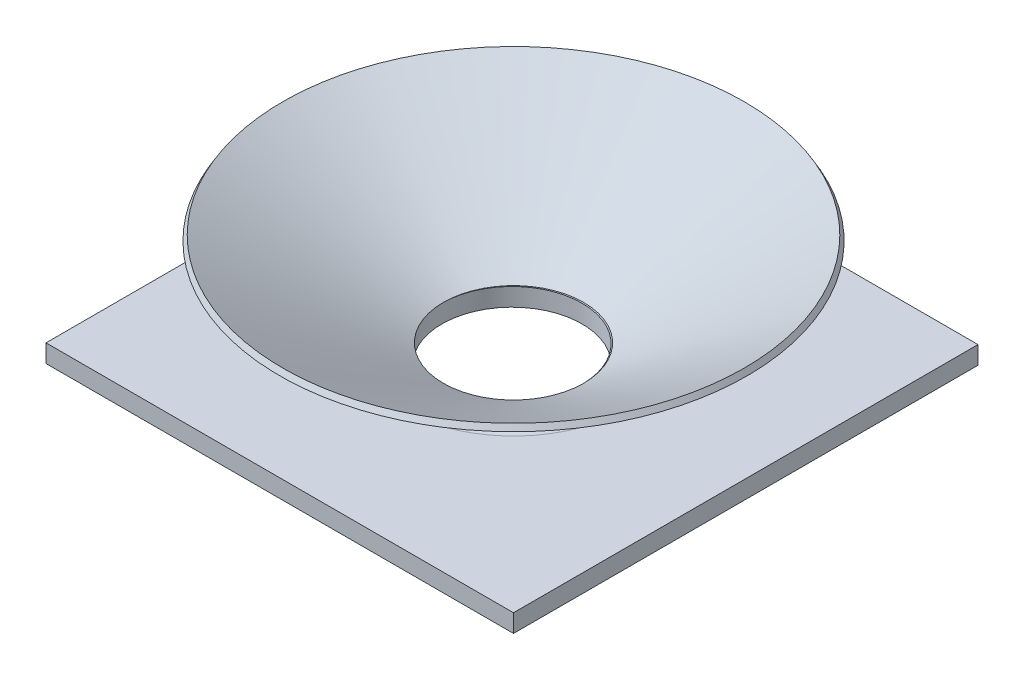
ISO-10303-21;
HEADER;
FILE_DESCRIPTION(('STEP AP214'),'2;1');
FILE_NAME('part.step','',(''),(''),'','','');
FILE_SCHEMA(('AUTOMOTIVE_DESIGN { 1 0 10303 214 1 1 1 1 }'));
ENDSEC;
DATA;
#1=APPLICATION_CONTEXT('core data for automotive mechanical design processes');
#2=APPLICATION_PROTOCOL_DEFINITION('international standard','automotive_design',2000,#1);
#3=PRODUCT_CONTEXT('',#1,'mechanical');
#4=PRODUCT('Part','Part','',(#3));
#5=PRODUCT_RELATED_PRODUCT_CATEGORY('part','',(#4));
#6=PRODUCT_DEFINITION_FORMATION('','',#4);
#7=PRODUCT_DEFINITION_CONTEXT('part definition',#1,'design');
#8=PRODUCT_DEFINITION('design','',#6,#7);
#9=PRODUCT_DEFINITION_SHAPE('','',#8);
#10=(LENGTH_UNIT() NAMED_UNIT(*) SI_UNIT(.MILLI.,.METRE.));
#11=(NAMED_UNIT(*) PLANE_ANGLE_UNIT() SI_UNIT($,.RADIAN.));
#12=(NAMED_UNIT(*) SI_UNIT($,.STERADIAN.) SOLID_ANGLE_UNIT());
#13=UNCERTAINTY_MEASURE_WITH_UNIT(LENGTH_MEASURE(1.E-05),#10,'distance_accuracy_value','');
#14=(GEOMETRIC_REPRESENTATION_CONTEXT(3) GLOBAL_UNCERTAINTY_ASSIGNED_CONTEXT((#13)) GLOBAL_UNIT_ASSIGNED_CONTEXT((#10,
#11,#12)) REPRESENTATION_CONTEXT('',''));
#15=CARTESIAN_POINT('',(0.,0.,0.));
#16=DIRECTION('',(0.,0.,1.));
#17=DIRECTION('',(1.,0.,0.));
#18=AXIS2_PLACEMENT_3D('',#15,#16,#17);
#19=CARTESIAN_POINT('',(-13.7068878020605,0.,0.));
#20=DIRECTION('',(0.,1.,0.));
#21=DIRECTION('',(0.,0.,1.));
#22=AXIS2_PLACEMENT_3D('',#19,#20,#21);
#23=PLANE('',#22);
#24=CARTESIAN_POINT('',(0.,0.,0.251460001656552));
#25=DIRECTION('',(0.,1.,0.));
#26=DIRECTION('',(0.,0.,1.));
#27=AXIS2_PLACEMENT_3D('',#24,#25,#26);
#28=CIRCLE('',#27,11.72);
#29=CARTESIAN_POINT('',(-11.7183670393751,0.,0.0558227595799678));
#30=VERTEX_POINT('',#29);
#31=CARTESIAN_POINT('',(11.7183670393751,0.,0.0558227595806369));
#32=VERTEX_POINT('',#31);
#33=EDGE_CURVE('E141',#30,#32,#28,.T.);
#34=ORIENTED_EDGE('',*,*,#33,.F.);
#35=CARTESIAN_POINT('',(0.,0.,0.));
#36=DIRECTION('',(0.,-1.,0.));
#37=DIRECTION('',(0.,0.,-1.));
#38=AXIS2_PLACEMENT_3D('',#35,#36,#37);
#39=CIRCLE('',#38,11.7185);
#40=EDGE_CURVE('E11',#32,#30,#39,.T.);
#41=ORIENTED_EDGE('',*,*,#40,.F.);
#42=EDGE_LOOP('',(#34,#41));
#43=FACE_BOUND('',#42,.T.);
#44=ADVANCED_FACE('F32',(#43),#23,.F.);
#45=CARTESIAN_POINT('',(0.,0.,0.));
#46=DIRECTION('',(0.,1.,0.));
#47=DIRECTION('',(0.,0.,1.));
#48=AXIS2_PLACEMENT_3D('',#45,#46,#47);
#49=CONICAL_SURFACE('',#48,11.7185,1.04382252715762);
#50=CARTESIAN_POINT('',(0.,15.625,0.));
#51=DIRECTION('',(0.,-1.,0.));
#52=DIRECTION('',(0.,0.,-1.));
#53=AXIS2_PLACEMENT_3D('',#50,#51,#52);
#54=CIRCLE('',#53,38.5720799966869);
#55=CARTESIAN_POINT('',(0.,15.625,-38.5720799966869));
#56=VERTEX_POINT('',#55);
#57=EDGE_CURVE('E39',#56,#56,#54,.T.);
#58=ORIENTED_EDGE('',*,*,#57,.F.);
#59=EDGE_LOOP('',(#58));
#60=FACE_BOUND('',#59,.T.);
#61=ORIENTED_EDGE('',*,*,#40,.T.);
#62=CARTESIAN_POINT('',(0.,0.,0.));
#63=DIRECTION('',(0.,-1.,0.));
#64=DIRECTION('',(0.,0.,-1.));
#65=AXIS2_PLACEMENT_3D('',#62,#63,#64);
#66=CIRCLE('',#65,11.7185);
#67=EDGE_CURVE('E49',#32,#30,#66,.F.);
#68=ORIENTED_EDGE('',*,*,#67,.F.);
#69=EDGE_LOOP('',(#61,#68));
#70=FACE_BOUND('',#69,.T.);
#71=ADVANCED_FACE('F135',(#60,#70),#49,.F.);
#72=CARTESIAN_POINT('',(0.,15.625,0.));
#73=DIRECTION('',(0.,-1.,0.));
#74=DIRECTION('',(0.,0.,-1.));
#75=AXIS2_PLACEMENT_3D('',#72,#73,#74);
#76=CONICAL_SURFACE('',#75,38.5720799966869,0.526973799637287);
#77=CARTESIAN_POINT('',(0.,14.7606670373823,0.));
#78=DIRECTION('',(0.,-1.,0.));
#79=DIRECTION('',(0.,0.,-1.));
#80=AXIS2_PLACEMENT_3D('',#77,#78,#79);
#81=CIRCLE('',#80,39.075);
#82=CARTESIAN_POINT('',(0.,14.7606670373823,-39.075));
#83=VERTEX_POINT('',#82);
#84=EDGE_CURVE('E128',#83,#83,#81,.T.);
#85=ORIENTED_EDGE('',*,*,#84,.F.);
#86=EDGE_LOOP('',(#85));
#87=FACE_BOUND('',#86,.T.);
#88=ORIENTED_EDGE('',*,*,#57,.T.);
#89=EDGE_LOOP('',(#88));
#90=FACE_BOUND('',#89,.T.);
#91=ADVANCED_FACE('F133',(#87,#90),#76,.T.);
#92=CARTESIAN_POINT('',(0.,14.7606670373823,0.));
#93=DIRECTION('',(0.,1.,0.));
#94=DIRECTION('',(0.,0.,1.));
#95=AXIS2_PLACEMENT_3D('',#92,#93,#94);
#96=CONICAL_SURFACE('',#95,39.075,1.04382252715762);
#97=CARTESIAN_POINT('',(0.,2.70802653812946,0.));
#98=DIRECTION('',(0.,-1.,0.));
#99=DIRECTION('',(0.,0.,-1.));
#100=AXIS2_PLACEMENT_3D('',#97,#98,#99);
#101=CIRCLE('',#100,18.3609810676484);
#102=CARTESIAN_POINT('',(0.,2.70802653812946,-18.3609810676484));
#103=VERTEX_POINT('',#102);
#104=EDGE_CURVE('E125',#103,#103,#101,.T.);
#105=ORIENTED_EDGE('',*,*,#104,.F.);
#106=EDGE_LOOP('',(#105));
#107=FACE_BOUND('',#106,.T.);
#108=ORIENTED_EDGE('',*,*,#84,.T.);
#109=EDGE_LOOP('',(#108));
#110=FACE_BOUND('',#109,.T.);
#111=ADVANCED_FACE('F172',(#107,#110),#96,.T.);
#112=CARTESIAN_POINT('',(0.,1.45254447163079,0.));
#113=DIRECTION('',(0.,-1.,0.));
#114=DIRECTION('',(0.,0.,-1.));
#115=AXIS2_PLACEMENT_3D('',#112,#113,#114);
#116=TOROIDAL_SURFACE('',#115,19.0914947381334,1.4525444716308);
#117=CARTESIAN_POINT('',(0.,0.,0.));
#118=DIRECTION('',(0.,-1.,0.));
#119=DIRECTION('',(0.,0.,-1.));
#120=AXIS2_PLACEMENT_3D('',#117,#118,#119);
#121=CIRCLE('',#120,19.0914947381334);
#122=CARTESIAN_POINT('',(0.,0.,-19.0914947381334));
#123=VERTEX_POINT('',#122);
#124=EDGE_CURVE('E122',#123,#123,#121,.T.);
#125=ORIENTED_EDGE('',*,*,#124,.F.);
#126=EDGE_LOOP('',(#125));
#127=FACE_BOUND('',#126,.T.);
#128=ORIENTED_EDGE('',*,*,#104,.T.);
#129=EDGE_LOOP('',(#128));
#130=FACE_BOUND('',#129,.T.);
#131=ADVANCED_FACE('F179',(#127,#130),#116,.F.);
#132=CARTESIAN_POINT('',(0.,0.,0.));
#133=DIRECTION('',(0.,-1.,0.));
#134=DIRECTION('',(0.,0.,-1.));
#135=AXIS2_PLACEMENT_3D('',#132,#133,#134);
#136=PLANE('',#135);
#137=EDGE_CURVE('E45',#32,#30,#28,.T.);
#138=ORIENTED_EDGE('',*,*,#137,.F.);
#139=ORIENTED_EDGE('',*,*,#67,.T.);
#140=EDGE_LOOP('',(#138,#139));
#141=FACE_BOUND('',#140,.T.);
#142=ADVANCED_FACE('F156',(#141),#136,.F.);
#143=CARTESIAN_POINT('',(-39.075,-3.,39.075));
#144=DIRECTION('',(-1.,0.,0.));
#145=DIRECTION('',(0.,0.,1.));
#146=AXIS2_PLACEMENT_3D('',#143,#144,#145);
#147=PLANE('',#146);
#148=DIRECTION('',(0.,0.,1.));
#149=VECTOR('',#148,1.);
#150=CARTESIAN_POINT('',(-39.075,0.,39.075));
#151=LINE('',#150,#149);
#152=CARTESIAN_POINT('',(-39.075,0.,-38.5720799966869));
#153=VERTEX_POINT('',#152);
#154=CARTESIAN_POINT('',(-39.075,0.,39.075));
#155=VERTEX_POINT('',#154);
#156=EDGE_CURVE('E111',#153,#155,#151,.T.);
#157=ORIENTED_EDGE('',*,*,#156,.F.);
#158=DIRECTION('',(0.,1.,0.));
#159=VECTOR('',#158,1.);
#160=CARTESIAN_POINT('',(-39.075,-3.,-38.5720799966869));
#161=LINE('',#160,#159);
#162=CARTESIAN_POINT('',(-39.075,-3.,-38.5720799966869));
#163=VERTEX_POINT('',#162);
#164=EDGE_CURVE('E100',#163,#153,#161,.T.);
#165=ORIENTED_EDGE('',*,*,#164,.F.);
#166=DIRECTION('',(0.,0.,1.));
#167=VECTOR('',#166,1.);
#168=CARTESIAN_POINT('',(-39.075,-3.,39.075));
#169=LINE('',#168,#167);
#170=CARTESIAN_POINT('',(-39.075,-3.,39.075));
#171=VERTEX_POINT('',#170);
#172=EDGE_CURVE('E94',#163,#171,#169,.T.);
#173=ORIENTED_EDGE('',*,*,#172,.T.);
#174=DIRECTION('',(0.,1.,0.));
#175=VECTOR('',#174,1.);
#176=CARTESIAN_POINT('',(-39.075,-3.,39.075));
#177=LINE('',#176,#175);
#178=EDGE_CURVE('E76',#171,#155,#177,.T.);
#179=ORIENTED_EDGE('',*,*,#178,.T.);
#180=EDGE_LOOP('',(#157,#165,#173,#179));
#181=FACE_BOUND('',#180,.T.);
#182=ADVANCED_FACE('F99',(#181),#147,.T.);
#183=CARTESIAN_POINT('',(-39.075,-3.,-38.5720799966869));
#184=DIRECTION('',(0.,0.,-1.));
#185=DIRECTION('',(-1.,0.,0.));
#186=AXIS2_PLACEMENT_3D('',#183,#184,#185);
#187=PLANE('',#186);
#188=DIRECTION('',(-1.,0.,0.));
#189=VECTOR('',#188,1.);
#190=CARTESIAN_POINT('',(-39.075,0.,-38.5720799966869));
#191=LINE('',#190,#189);
#192=CARTESIAN_POINT('',(39.075,0.,-38.5720799966869));
#193=VERTEX_POINT('',#192);
#194=EDGE_CURVE('E101',#193,#153,#191,.T.);
#195=ORIENTED_EDGE('',*,*,#194,.F.);
#196=DIRECTION('',(0.,1.,0.));
#197=VECTOR('',#196,1.);
#198=CARTESIAN_POINT('',(39.075,-3.,-38.5720799966869));
#199=LINE('',#198,#197);
#200=CARTESIAN_POINT('',(39.075,-3.,-38.5720799966869));
#201=VERTEX_POINT('',#200);
#202=EDGE_CURVE('E118',#201,#193,#199,.T.);
#203=ORIENTED_EDGE('',*,*,#202,.F.);
#204=DIRECTION('',(-1.,0.,0.));
#205=VECTOR('',#204,1.);
#206=CARTESIAN_POINT('',(-39.075,-3.,-38.5720799966869));
#207=LINE('',#206,#205);
#208=EDGE_CURVE('E87',#201,#163,#207,.T.);
#209=ORIENTED_EDGE('',*,*,#208,.T.);
#210=ORIENTED_EDGE('',*,*,#164,.T.);
#211=EDGE_LOOP('',(#195,#203,#209,#210));
#212=FACE_BOUND('',#211,.T.);
#213=ADVANCED_FACE('F199',(#212),#187,.T.);
#214=CARTESIAN_POINT('',(39.075,-3.,39.075));
#215=DIRECTION('',(1.,0.,0.));
#216=DIRECTION('',(0.,0.,-1.));
#217=AXIS2_PLACEMENT_3D('',#214,#215,#216);
#218=PLANE('',#217);
#219=DIRECTION('',(0.,0.,-1.));
#220=VECTOR('',#219,1.);
#221=CARTESIAN_POINT('',(39.075,0.,39.075));
#222=LINE('',#221,#220);
#223=CARTESIAN_POINT('',(39.075,0.,39.075));
#224=VERTEX_POINT('',#223);
#225=EDGE_CURVE('E104',#224,#193,#222,.T.);
#226=ORIENTED_EDGE('',*,*,#225,.F.);
#227=DIRECTION('',(0.,1.,0.));
#228=VECTOR('',#227,1.);
#229=CARTESIAN_POINT('',(39.075,-3.,39.075));
#230=LINE('',#229,#228);
#231=CARTESIAN_POINT('',(39.075,-3.,39.075));
#232=VERTEX_POINT('',#231);
#233=EDGE_CURVE('E86',#232,#224,#230,.T.);
#234=ORIENTED_EDGE('',*,*,#233,.F.);
#235=DIRECTION('',(0.,0.,-1.));
#236=VECTOR('',#235,1.);
#237=CARTESIAN_POINT('',(39.075,-3.,39.075));
#238=LINE('',#237,#236);
#239=EDGE_CURVE('E97',#232,#201,#238,.T.);
#240=ORIENTED_EDGE('',*,*,#239,.T.);
#241=ORIENTED_EDGE('',*,*,#202,.T.);
#242=EDGE_LOOP('',(#226,#234,#240,#241));
#243=FACE_BOUND('',#242,.T.);
#244=ADVANCED_FACE('F206',(#243),#218,.T.);
#245=CARTESIAN_POINT('',(-39.075,-3.,39.075));
#246=DIRECTION('',(0.,0.,1.));
#247=DIRECTION('',(1.,0.,0.));
#248=AXIS2_PLACEMENT_3D('',#245,#246,#247);
#249=PLANE('',#248);
#250=DIRECTION('',(1.,0.,0.));
#251=VECTOR('',#250,1.);
#252=CARTESIAN_POINT('',(-39.075,0.,39.075));
#253=LINE('',#252,#251);
#254=EDGE_CURVE('E81',#155,#224,#253,.T.);
#255=ORIENTED_EDGE('',*,*,#254,.F.);
#256=ORIENTED_EDGE('',*,*,#178,.F.);
#257=DIRECTION('',(1.,0.,0.));
#258=VECTOR('',#257,1.);
#259=CARTESIAN_POINT('',(-39.075,-3.,39.075));
#260=LINE('',#259,#258);
#261=EDGE_CURVE('E79',#171,#232,#260,.T.);
#262=ORIENTED_EDGE('',*,*,#261,.T.);
#263=ORIENTED_EDGE('',*,*,#233,.T.);
#264=EDGE_LOOP('',(#255,#256,#262,#263));
#265=FACE_BOUND('',#264,.T.);
#266=ADVANCED_FACE('F78',(#265),#249,.T.);
#267=CARTESIAN_POINT('',(0.,-3.,0.));
#268=DIRECTION('',(0.,-1.,0.));
#269=DIRECTION('',(0.,0.,-1.));
#270=AXIS2_PLACEMENT_3D('',#267,#268,#269);
#271=PLANE('',#270);
#272=CARTESIAN_POINT('',(0.,-3.,0.251460001656552));
#273=DIRECTION('',(0.,1.,0.));
#274=DIRECTION('',(0.,0.,1.));
#275=AXIS2_PLACEMENT_3D('',#272,#273,#274);
#276=CIRCLE('',#275,11.72);
#277=CARTESIAN_POINT('',(0.,-3.,11.9714600016566));
#278=VERTEX_POINT('',#277);
#279=EDGE_CURVE('E113',#278,#278,#276,.T.);
#280=ORIENTED_EDGE('',*,*,#279,.T.);
#281=EDGE_LOOP('',(#280));
#282=FACE_BOUND('',#281,.T.);
#283=ORIENTED_EDGE('',*,*,#172,.F.);
#284=ORIENTED_EDGE('',*,*,#208,.F.);
#285=ORIENTED_EDGE('',*,*,#239,.F.);
#286=ORIENTED_EDGE('',*,*,#261,.F.);
#287=EDGE_LOOP('',(#283,#284,#285,#286));
#288=FACE_BOUND('',#287,.T.);
#289=ADVANCED_FACE('F92',(#282,#288),#271,.T.);
#290=ORIENTED_EDGE('',*,*,#124,.T.);
#291=EDGE_LOOP('',(#290));
#292=FACE_BOUND('',#291,.T.);
#293=ORIENTED_EDGE('',*,*,#156,.T.);
#294=ORIENTED_EDGE('',*,*,#254,.T.);
#295=ORIENTED_EDGE('',*,*,#225,.T.);
#296=ORIENTED_EDGE('',*,*,#194,.T.);
#297=EDGE_LOOP('',(#293,#294,#295,#296));
#298=FACE_BOUND('',#297,.T.);
#299=ADVANCED_FACE('F149',(#292,#298),#136,.F.);
#300=CARTESIAN_POINT('',(0.,-3.,0.251460001656552));
#301=DIRECTION('',(0.,1.,0.));
#302=DIRECTION('',(0.,0.,1.));
#303=AXIS2_PLACEMENT_3D('',#300,#301,#302);
#304=CYLINDRICAL_SURFACE('',#303,11.72);
#305=ORIENTED_EDGE('',*,*,#279,.F.);
#306=EDGE_LOOP('',(#305));
#307=FACE_BOUND('',#306,.T.);
#308=ORIENTED_EDGE('',*,*,#137,.T.);
#309=ORIENTED_EDGE('',*,*,#33,.T.);
#310=EDGE_LOOP('',(#308,#309));
#311=FACE_BOUND('',#310,.T.);
#312=ADVANCED_FACE('F147',(#307,#311),#304,.F.);
#313=CLOSED_SHELL('',(#44,#71,#91,#111,#131,#142,#182,#213,#244,#266,#289,#299,#312));
#314=MANIFOLD_SOLID_BREP('B2',#313);
#315=ADVANCED_BREP_SHAPE_REPRESENTATION('',(#18,#314),#14);
#316=SHAPE_DEFINITION_REPRESENTATION(#9,#315);
ENDSEC;
END-ISO-10303-21;
